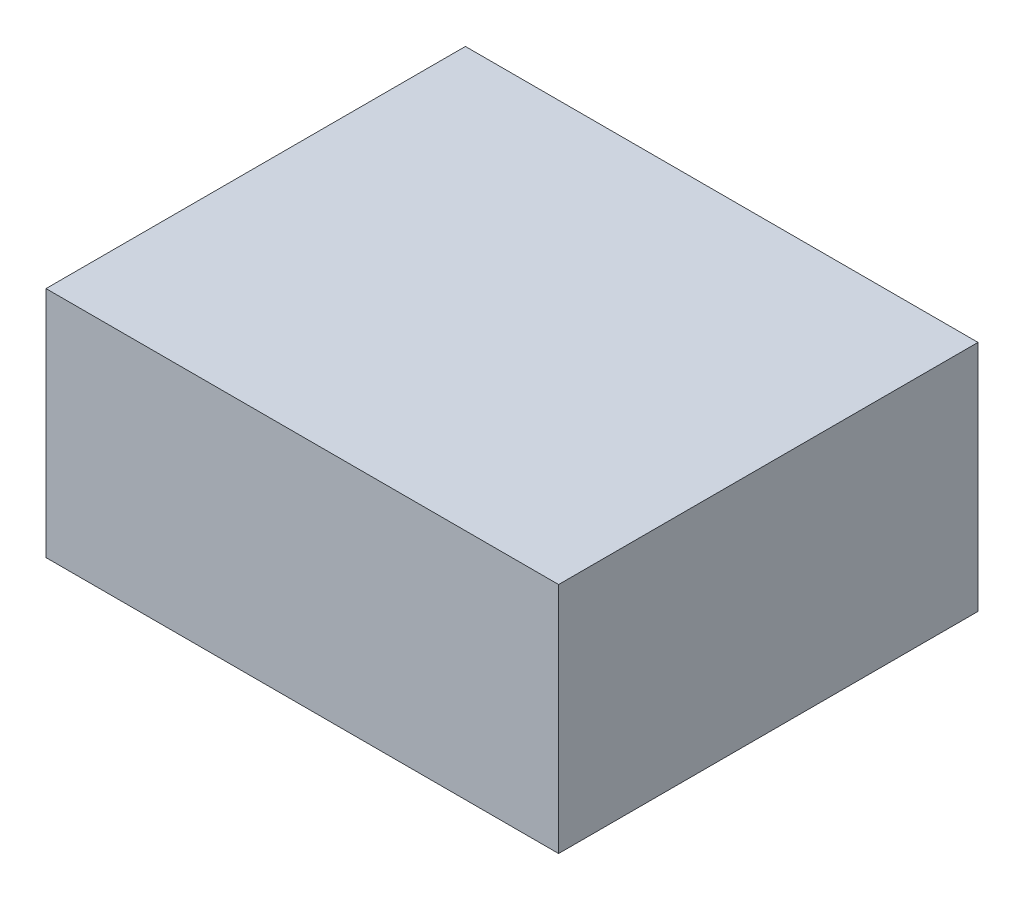
ISO-10303-21;
HEADER;
FILE_DESCRIPTION(('STEP AP214'),'2;1');
FILE_NAME('part.step','',(''),(''),'','','');
FILE_SCHEMA(('AUTOMOTIVE_DESIGN { 1 0 10303 214 1 1 1 1 }'));
ENDSEC;
DATA;
#1=APPLICATION_CONTEXT('core data for automotive mechanical design processes');
#2=APPLICATION_PROTOCOL_DEFINITION('international standard','automotive_design',2000,#1);
#3=PRODUCT_CONTEXT('',#1,'mechanical');
#4=PRODUCT('Part','Part','',(#3));
#5=PRODUCT_RELATED_PRODUCT_CATEGORY('part','',(#4));
#6=PRODUCT_DEFINITION_FORMATION('','',#4);
#7=PRODUCT_DEFINITION_CONTEXT('part definition',#1,'design');
#8=PRODUCT_DEFINITION('design','',#6,#7);
#9=PRODUCT_DEFINITION_SHAPE('','',#8);
#10=(LENGTH_UNIT() NAMED_UNIT(*) SI_UNIT(.MILLI.,.METRE.));
#11=(NAMED_UNIT(*) PLANE_ANGLE_UNIT() SI_UNIT($,.RADIAN.));
#12=(NAMED_UNIT(*) SI_UNIT($,.STERADIAN.) SOLID_ANGLE_UNIT());
#13=UNCERTAINTY_MEASURE_WITH_UNIT(LENGTH_MEASURE(1.E-05),#10,'distance_accuracy_value','');
#14=(GEOMETRIC_REPRESENTATION_CONTEXT(3) GLOBAL_UNCERTAINTY_ASSIGNED_CONTEXT((#13)) GLOBAL_UNIT_ASSIGNED_CONTEXT((#10,
#11,#12)) REPRESENTATION_CONTEXT('',''));
#15=CARTESIAN_POINT('',(0.,0.,0.));
#16=DIRECTION('',(0.,0.,1.));
#17=DIRECTION('',(1.,0.,0.));
#18=AXIS2_PLACEMENT_3D('',#15,#16,#17);
#19=CARTESIAN_POINT('',(0.,31.75,0.));
#20=DIRECTION('',(-1.,0.,0.));
#21=DIRECTION('',(0.,0.,1.));
#22=AXIS2_PLACEMENT_3D('',#19,#20,#21);
#23=PLANE('',#22);
#24=DIRECTION('',(0.,0.,-1.));
#25=VECTOR('',#24,1.);
#26=CARTESIAN_POINT('',(0.,0.,0.));
#27=LINE('',#26,#25);
#28=CARTESIAN_POINT('',(0.,0.,0.));
#29=VERTEX_POINT('',#28);
#30=CARTESIAN_POINT('',(0.,0.,-57.15));
#31=VERTEX_POINT('',#30);
#32=EDGE_CURVE('E98',#29,#31,#27,.T.);
#33=ORIENTED_EDGE('',*,*,#32,.F.);
#34=DIRECTION('',(0.,-1.,0.));
#35=VECTOR('',#34,1.);
#36=CARTESIAN_POINT('',(0.,31.75,0.));
#37=LINE('',#36,#35);
#38=CARTESIAN_POINT('',(0.,31.75,0.));
#39=VERTEX_POINT('',#38);
#40=EDGE_CURVE('E11',#39,#29,#37,.T.);
#41=ORIENTED_EDGE('',*,*,#40,.F.);
#42=DIRECTION('',(0.,0.,-1.));
#43=VECTOR('',#42,1.);
#44=CARTESIAN_POINT('',(0.,31.75,0.));
#45=LINE('',#44,#43);
#46=CARTESIAN_POINT('',(0.,31.75,-57.15));
#47=VERTEX_POINT('',#46);
#48=EDGE_CURVE('E93',#39,#47,#45,.T.);
#49=ORIENTED_EDGE('',*,*,#48,.T.);
#50=DIRECTION('',(0.,-1.,0.));
#51=VECTOR('',#50,1.);
#52=CARTESIAN_POINT('',(0.,31.75,-57.15));
#53=LINE('',#52,#51);
#54=EDGE_CURVE('E36',#47,#31,#53,.T.);
#55=ORIENTED_EDGE('',*,*,#54,.T.);
#56=EDGE_LOOP('',(#33,#41,#49,#55));
#57=FACE_BOUND('',#56,.T.);
#58=ADVANCED_FACE('F33',(#57),#23,.T.);
#59=CARTESIAN_POINT('',(0.,31.75,0.));
#60=DIRECTION('',(0.,0.,-1.));
#61=DIRECTION('',(-1.,0.,0.));
#62=AXIS2_PLACEMENT_3D('',#59,#60,#61);
#63=PLANE('',#62);
#64=DIRECTION('',(1.,0.,0.));
#65=VECTOR('',#64,1.);
#66=CARTESIAN_POINT('',(0.,0.,0.));
#67=LINE('',#66,#65);
#68=CARTESIAN_POINT('',(69.85,0.,0.));
#69=VERTEX_POINT('',#68);
#70=EDGE_CURVE('E66',#29,#69,#67,.T.);
#71=ORIENTED_EDGE('',*,*,#70,.T.);
#72=DIRECTION('',(0.,-1.,0.));
#73=VECTOR('',#72,1.);
#74=CARTESIAN_POINT('',(69.85,31.75,0.));
#75=LINE('',#74,#73);
#76=CARTESIAN_POINT('',(69.85,31.75,0.));
#77=VERTEX_POINT('',#76);
#78=EDGE_CURVE('E42',#77,#69,#75,.T.);
#79=ORIENTED_EDGE('',*,*,#78,.F.);
#80=DIRECTION('',(1.,0.,0.));
#81=VECTOR('',#80,1.);
#82=CARTESIAN_POINT('',(0.,31.75,0.));
#83=LINE('',#82,#81);
#84=EDGE_CURVE('E83',#39,#77,#83,.T.);
#85=ORIENTED_EDGE('',*,*,#84,.F.);
#86=ORIENTED_EDGE('',*,*,#40,.T.);
#87=EDGE_LOOP('',(#71,#79,#85,#86));
#88=FACE_BOUND('',#87,.T.);
#89=ADVANCED_FACE('F108',(#88),#63,.F.);
#90=CARTESIAN_POINT('',(69.85,31.75,0.));
#91=DIRECTION('',(-1.,0.,0.));
#92=DIRECTION('',(0.,0.,1.));
#93=AXIS2_PLACEMENT_3D('',#90,#91,#92);
#94=PLANE('',#93);
#95=DIRECTION('',(0.,0.,-1.));
#96=VECTOR('',#95,1.);
#97=CARTESIAN_POINT('',(69.85,0.,0.));
#98=LINE('',#97,#96);
#99=CARTESIAN_POINT('',(69.85,0.,-57.15));
#100=VERTEX_POINT('',#99);
#101=EDGE_CURVE('E90',#69,#100,#98,.T.);
#102=ORIENTED_EDGE('',*,*,#101,.T.);
#103=DIRECTION('',(0.,-1.,0.));
#104=VECTOR('',#103,1.);
#105=CARTESIAN_POINT('',(69.85,31.75,-57.15));
#106=LINE('',#105,#104);
#107=CARTESIAN_POINT('',(69.85,31.75,-57.15));
#108=VERTEX_POINT('',#107);
#109=EDGE_CURVE('E87',#108,#100,#106,.T.);
#110=ORIENTED_EDGE('',*,*,#109,.F.);
#111=DIRECTION('',(0.,0.,-1.));
#112=VECTOR('',#111,1.);
#113=CARTESIAN_POINT('',(69.85,31.75,0.));
#114=LINE('',#113,#112);
#115=EDGE_CURVE('E78',#77,#108,#114,.T.);
#116=ORIENTED_EDGE('',*,*,#115,.F.);
#117=ORIENTED_EDGE('',*,*,#78,.T.);
#118=EDGE_LOOP('',(#102,#110,#116,#117));
#119=FACE_BOUND('',#118,.T.);
#120=ADVANCED_FACE('F88',(#119),#94,.F.);
#121=CARTESIAN_POINT('',(0.,31.75,-57.15));
#122=DIRECTION('',(0.,0.,-1.));
#123=DIRECTION('',(-1.,0.,0.));
#124=AXIS2_PLACEMENT_3D('',#121,#122,#123);
#125=PLANE('',#124);
#126=DIRECTION('',(1.,0.,0.));
#127=VECTOR('',#126,1.);
#128=CARTESIAN_POINT('',(0.,0.,-57.15));
#129=LINE('',#128,#127);
#130=EDGE_CURVE('E101',#31,#100,#129,.T.);
#131=ORIENTED_EDGE('',*,*,#130,.F.);
#132=ORIENTED_EDGE('',*,*,#54,.F.);
#133=DIRECTION('',(1.,0.,0.));
#134=VECTOR('',#133,1.);
#135=CARTESIAN_POINT('',(0.,31.75,-57.15));
#136=LINE('',#135,#134);
#137=EDGE_CURVE('E82',#47,#108,#136,.T.);
#138=ORIENTED_EDGE('',*,*,#137,.T.);
#139=ORIENTED_EDGE('',*,*,#109,.T.);
#140=EDGE_LOOP('',(#131,#132,#138,#139));
#141=FACE_BOUND('',#140,.T.);
#142=ADVANCED_FACE('F92',(#141),#125,.T.);
#143=CARTESIAN_POINT('',(0.,31.75,0.));
#144=DIRECTION('',(0.,-1.,0.));
#145=DIRECTION('',(0.,0.,-1.));
#146=AXIS2_PLACEMENT_3D('',#143,#144,#145);
#147=PLANE('',#146);
#148=ORIENTED_EDGE('',*,*,#48,.F.);
#149=ORIENTED_EDGE('',*,*,#84,.T.);
#150=ORIENTED_EDGE('',*,*,#115,.T.);
#151=ORIENTED_EDGE('',*,*,#137,.F.);
#152=EDGE_LOOP('',(#148,#149,#150,#151));
#153=FACE_BOUND('',#152,.T.);
#154=ADVANCED_FACE('F81',(#153),#147,.F.);
#155=CARTESIAN_POINT('',(0.,0.,0.));
#156=DIRECTION('',(0.,-1.,0.));
#157=DIRECTION('',(0.,0.,-1.));
#158=AXIS2_PLACEMENT_3D('',#155,#156,#157);
#159=PLANE('',#158);
#160=ORIENTED_EDGE('',*,*,#32,.T.);
#161=ORIENTED_EDGE('',*,*,#130,.T.);
#162=ORIENTED_EDGE('',*,*,#101,.F.);
#163=ORIENTED_EDGE('',*,*,#70,.F.);
#164=EDGE_LOOP('',(#160,#161,#162,#163));
#165=FACE_BOUND('',#164,.T.);
#166=ADVANCED_FACE('F106',(#165),#159,.T.);
#167=CLOSED_SHELL('',(#58,#89,#120,#142,#154,#166));
#168=MANIFOLD_SOLID_BREP('B2',#167);
#169=ADVANCED_BREP_SHAPE_REPRESENTATION('',(#18,#168),#14);
#170=SHAPE_DEFINITION_REPRESENTATION(#9,#169);
ENDSEC;
END-ISO-10303-21;
